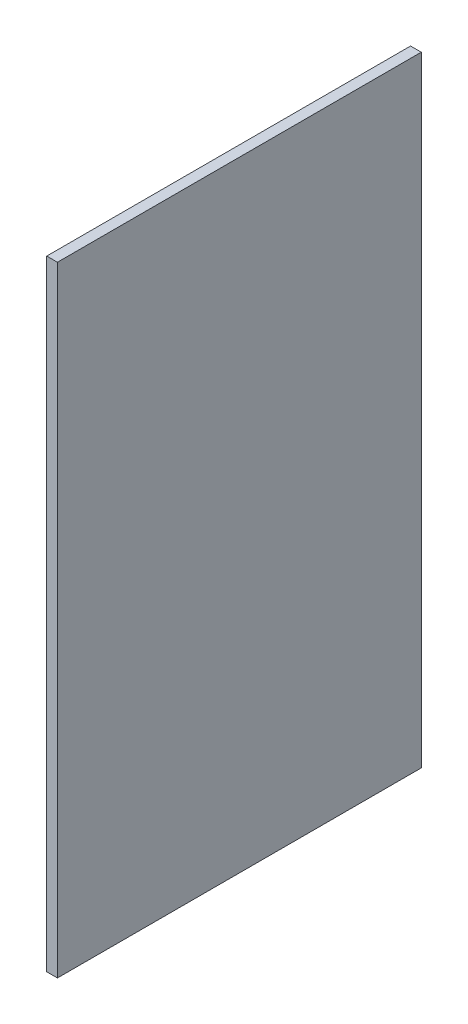
ISO-10303-21;
HEADER;
FILE_DESCRIPTION(('STEP AP214'),'2;1');
FILE_NAME('part.step','',(''),(''),'','','');
FILE_SCHEMA(('AUTOMOTIVE_DESIGN { 1 0 10303 214 1 1 1 1 }'));
ENDSEC;
DATA;
#1=APPLICATION_CONTEXT('core data for automotive mechanical design processes');
#2=APPLICATION_PROTOCOL_DEFINITION('international standard','automotive_design',2000,#1);
#3=PRODUCT_CONTEXT('',#1,'mechanical');
#4=PRODUCT('Part','Part','',(#3));
#5=PRODUCT_RELATED_PRODUCT_CATEGORY('part','',(#4));
#6=PRODUCT_DEFINITION_FORMATION('','',#4);
#7=PRODUCT_DEFINITION_CONTEXT('part definition',#1,'design');
#8=PRODUCT_DEFINITION('design','',#6,#7);
#9=PRODUCT_DEFINITION_SHAPE('','',#8);
#10=(LENGTH_UNIT() NAMED_UNIT(*) SI_UNIT(.MILLI.,.METRE.));
#11=(NAMED_UNIT(*) PLANE_ANGLE_UNIT() SI_UNIT($,.RADIAN.));
#12=(NAMED_UNIT(*) SI_UNIT($,.STERADIAN.) SOLID_ANGLE_UNIT());
#13=UNCERTAINTY_MEASURE_WITH_UNIT(LENGTH_MEASURE(1.E-05),#10,'distance_accuracy_value','');
#14=(GEOMETRIC_REPRESENTATION_CONTEXT(3) GLOBAL_UNCERTAINTY_ASSIGNED_CONTEXT((#13)) GLOBAL_UNIT_ASSIGNED_CONTEXT((#10,
#11,#12)) REPRESENTATION_CONTEXT('',''));
#15=CARTESIAN_POINT('',(0.,0.,0.));
#16=DIRECTION('',(0.,0.,1.));
#17=DIRECTION('',(1.,0.,0.));
#18=AXIS2_PLACEMENT_3D('',#15,#16,#17);
#19=CARTESIAN_POINT('',(3.175,92.,-54.));
#20=DIRECTION('',(0.,0.,1.));
#21=DIRECTION('',(0.,-1.,0.));
#22=AXIS2_PLACEMENT_3D('',#19,#20,#21);
#23=PLANE('',#22);
#24=DIRECTION('',(0.,1.,0.));
#25=VECTOR('',#24,1.);
#26=CARTESIAN_POINT('',(0.,92.,-54.));
#27=LINE('',#26,#25);
#28=CARTESIAN_POINT('',(0.,-92.,-54.));
#29=VERTEX_POINT('',#28);
#30=CARTESIAN_POINT('',(0.,92.,-54.));
#31=VERTEX_POINT('',#30);
#32=EDGE_CURVE('E96',#29,#31,#27,.T.);
#33=ORIENTED_EDGE('',*,*,#32,.T.);
#34=DIRECTION('',(-1.,0.,0.));
#35=VECTOR('',#34,1.);
#36=CARTESIAN_POINT('',(3.175,92.,-54.));
#37=LINE('',#36,#35);
#38=CARTESIAN_POINT('',(3.175,92.,-54.));
#39=VERTEX_POINT('',#38);
#40=EDGE_CURVE('E11',#39,#31,#37,.T.);
#41=ORIENTED_EDGE('',*,*,#40,.F.);
#42=DIRECTION('',(0.,1.,0.));
#43=VECTOR('',#42,1.);
#44=CARTESIAN_POINT('',(3.175,92.,-54.));
#45=LINE('',#44,#43);
#46=CARTESIAN_POINT('',(3.175,-92.,-54.));
#47=VERTEX_POINT('',#46);
#48=EDGE_CURVE('E84',#47,#39,#45,.T.);
#49=ORIENTED_EDGE('',*,*,#48,.F.);
#50=DIRECTION('',(-1.,0.,0.));
#51=VECTOR('',#50,1.);
#52=CARTESIAN_POINT('',(3.175,-92.,-54.));
#53=LINE('',#52,#51);
#54=EDGE_CURVE('E92',#47,#29,#53,.T.);
#55=ORIENTED_EDGE('',*,*,#54,.T.);
#56=EDGE_LOOP('',(#33,#41,#49,#55));
#57=FACE_BOUND('',#56,.T.);
#58=ADVANCED_FACE('F33',(#57),#23,.F.);
#59=CARTESIAN_POINT('',(3.175,92.,54.));
#60=DIRECTION('',(0.,-1.,0.));
#61=DIRECTION('',(0.,0.,-1.));
#62=AXIS2_PLACEMENT_3D('',#59,#60,#61);
#63=PLANE('',#62);
#64=DIRECTION('',(0.,0.,1.));
#65=VECTOR('',#64,1.);
#66=CARTESIAN_POINT('',(0.,92.,54.));
#67=LINE('',#66,#65);
#68=CARTESIAN_POINT('',(0.,92.,54.));
#69=VERTEX_POINT('',#68);
#70=EDGE_CURVE('E88',#31,#69,#67,.T.);
#71=ORIENTED_EDGE('',*,*,#70,.T.);
#72=DIRECTION('',(-1.,0.,0.));
#73=VECTOR('',#72,1.);
#74=CARTESIAN_POINT('',(3.175,92.,54.));
#75=LINE('',#74,#73);
#76=CARTESIAN_POINT('',(3.175,92.,54.));
#77=VERTEX_POINT('',#76);
#78=EDGE_CURVE('E41',#77,#69,#75,.T.);
#79=ORIENTED_EDGE('',*,*,#78,.F.);
#80=DIRECTION('',(0.,0.,1.));
#81=VECTOR('',#80,1.);
#82=CARTESIAN_POINT('',(3.175,92.,54.));
#83=LINE('',#82,#81);
#84=EDGE_CURVE('E79',#39,#77,#83,.T.);
#85=ORIENTED_EDGE('',*,*,#84,.F.);
#86=ORIENTED_EDGE('',*,*,#40,.T.);
#87=EDGE_LOOP('',(#71,#79,#85,#86));
#88=FACE_BOUND('',#87,.T.);
#89=ADVANCED_FACE('F87',(#88),#63,.F.);
#90=CARTESIAN_POINT('',(3.175,92.,54.));
#91=DIRECTION('',(0.,0.,-1.));
#92=DIRECTION('',(0.,1.,0.));
#93=AXIS2_PLACEMENT_3D('',#90,#91,#92);
#94=PLANE('',#93);
#95=DIRECTION('',(0.,-1.,0.));
#96=VECTOR('',#95,1.);
#97=CARTESIAN_POINT('',(0.,92.,54.));
#98=LINE('',#97,#96);
#99=CARTESIAN_POINT('',(0.,-92.,54.));
#100=VERTEX_POINT('',#99);
#101=EDGE_CURVE('E66',#69,#100,#98,.T.);
#102=ORIENTED_EDGE('',*,*,#101,.T.);
#103=DIRECTION('',(-1.,0.,0.));
#104=VECTOR('',#103,1.);
#105=CARTESIAN_POINT('',(3.175,-92.,54.));
#106=LINE('',#105,#104);
#107=CARTESIAN_POINT('',(3.175,-92.,54.));
#108=VERTEX_POINT('',#107);
#109=EDGE_CURVE('E89',#108,#100,#106,.T.);
#110=ORIENTED_EDGE('',*,*,#109,.F.);
#111=DIRECTION('',(0.,-1.,0.));
#112=VECTOR('',#111,1.);
#113=CARTESIAN_POINT('',(3.175,92.,54.));
#114=LINE('',#113,#112);
#115=EDGE_CURVE('E82',#77,#108,#114,.T.);
#116=ORIENTED_EDGE('',*,*,#115,.F.);
#117=ORIENTED_EDGE('',*,*,#78,.T.);
#118=EDGE_LOOP('',(#102,#110,#116,#117));
#119=FACE_BOUND('',#118,.T.);
#120=ADVANCED_FACE('F90',(#119),#94,.F.);
#121=CARTESIAN_POINT('',(3.175,-92.,54.));
#122=DIRECTION('',(0.,1.,0.));
#123=DIRECTION('',(0.,0.,1.));
#124=AXIS2_PLACEMENT_3D('',#121,#122,#123);
#125=PLANE('',#124);
#126=DIRECTION('',(0.,0.,-1.));
#127=VECTOR('',#126,1.);
#128=CARTESIAN_POINT('',(0.,-92.,54.));
#129=LINE('',#128,#127);
#130=EDGE_CURVE('E72',#100,#29,#129,.T.);
#131=ORIENTED_EDGE('',*,*,#130,.T.);
#132=ORIENTED_EDGE('',*,*,#54,.F.);
#133=DIRECTION('',(0.,0.,-1.));
#134=VECTOR('',#133,1.);
#135=CARTESIAN_POINT('',(3.175,-92.,54.));
#136=LINE('',#135,#134);
#137=EDGE_CURVE('E49',#108,#47,#136,.T.);
#138=ORIENTED_EDGE('',*,*,#137,.F.);
#139=ORIENTED_EDGE('',*,*,#109,.T.);
#140=EDGE_LOOP('',(#131,#132,#138,#139));
#141=FACE_BOUND('',#140,.T.);
#142=ADVANCED_FACE('F103',(#141),#125,.F.);
#143=CARTESIAN_POINT('',(3.175,0.,0.));
#144=DIRECTION('',(1.,0.,0.));
#145=DIRECTION('',(0.,0.,-1.));
#146=AXIS2_PLACEMENT_3D('',#143,#144,#145);
#147=PLANE('',#146);
#148=ORIENTED_EDGE('',*,*,#48,.T.);
#149=ORIENTED_EDGE('',*,*,#84,.T.);
#150=ORIENTED_EDGE('',*,*,#115,.T.);
#151=ORIENTED_EDGE('',*,*,#137,.T.);
#152=EDGE_LOOP('',(#148,#149,#150,#151));
#153=FACE_BOUND('',#152,.T.);
#154=ADVANCED_FACE('F80',(#153),#147,.T.);
#155=CARTESIAN_POINT('',(0.,0.,0.));
#156=DIRECTION('',(1.,0.,0.));
#157=DIRECTION('',(0.,0.,-1.));
#158=AXIS2_PLACEMENT_3D('',#155,#156,#157);
#159=PLANE('',#158);
#160=ORIENTED_EDGE('',*,*,#32,.F.);
#161=ORIENTED_EDGE('',*,*,#130,.F.);
#162=ORIENTED_EDGE('',*,*,#101,.F.);
#163=ORIENTED_EDGE('',*,*,#70,.F.);
#164=EDGE_LOOP('',(#160,#161,#162,#163));
#165=FACE_BOUND('',#164,.T.);
#166=ADVANCED_FACE('F106',(#165),#159,.F.);
#167=CLOSED_SHELL('',(#58,#89,#120,#142,#154,#166));
#168=MANIFOLD_SOLID_BREP('B2',#167);
#169=ADVANCED_BREP_SHAPE_REPRESENTATION('',(#18,#168),#14);
#170=SHAPE_DEFINITION_REPRESENTATION(#9,#169);
ENDSEC;
END-ISO-10303-21;
